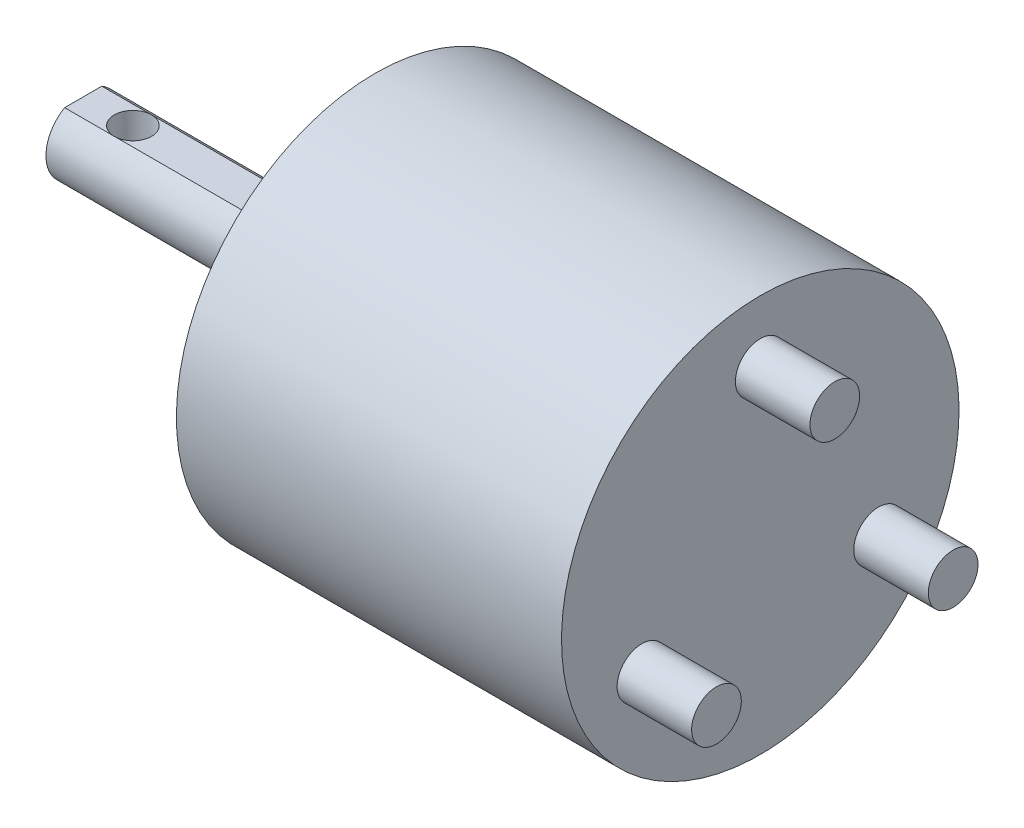
ISO-10303-21;
HEADER;
FILE_DESCRIPTION(('STEP AP214'),'2;1');
FILE_NAME('part.step','',(''),(''),'','','');
FILE_SCHEMA(('AUTOMOTIVE_DESIGN { 1 0 10303 214 1 1 1 1 }'));
ENDSEC;
DATA;
#1=APPLICATION_CONTEXT('core data for automotive mechanical design processes');
#2=APPLICATION_PROTOCOL_DEFINITION('international standard','automotive_design',2000,#1);
#3=PRODUCT_CONTEXT('',#1,'mechanical');
#4=PRODUCT('Part','Part','',(#3));
#5=PRODUCT_RELATED_PRODUCT_CATEGORY('part','',(#4));
#6=PRODUCT_DEFINITION_FORMATION('','',#4);
#7=PRODUCT_DEFINITION_CONTEXT('part definition',#1,'design');
#8=PRODUCT_DEFINITION('design','',#6,#7);
#9=PRODUCT_DEFINITION_SHAPE('','',#8);
#10=(LENGTH_UNIT() NAMED_UNIT(*) SI_UNIT(.MILLI.,.METRE.));
#11=(NAMED_UNIT(*) PLANE_ANGLE_UNIT() SI_UNIT($,.RADIAN.));
#12=(NAMED_UNIT(*) SI_UNIT($,.STERADIAN.) SOLID_ANGLE_UNIT());
#13=UNCERTAINTY_MEASURE_WITH_UNIT(LENGTH_MEASURE(1.E-05),#10,'distance_accuracy_value','');
#14=(GEOMETRIC_REPRESENTATION_CONTEXT(3) GLOBAL_UNCERTAINTY_ASSIGNED_CONTEXT((#13)) GLOBAL_UNIT_ASSIGNED_CONTEXT((#10,
#11,#12)) REPRESENTATION_CONTEXT('',''));
#15=CARTESIAN_POINT('',(0.,0.,0.));
#16=DIRECTION('',(0.,0.,1.));
#17=DIRECTION('',(1.,0.,0.));
#18=AXIS2_PLACEMENT_3D('',#15,#16,#17);
#19=CARTESIAN_POINT('',(-13.625,1.3,0.748331477));
#20=DIRECTION('',(0.,-1.,0.));
#21=DIRECTION('',(0.,0.,-1.));
#22=AXIS2_PLACEMENT_3D('',#19,#20,#21);
#23=PLANE('',#22);
#24=DIRECTION('',(1.,0.,0.));
#25=VECTOR('',#24,1.);
#26=CARTESIAN_POINT('',(-9.05,1.30000000000835,-0.748331477340291));
#27=LINE('',#26,#25);
#28=CARTESIAN_POINT('',(-5.8250000018,1.30000000000209,-0.748331477347535));
#29=VERTEX_POINT('',#28);
#30=CARTESIAN_POINT('',(-11.625,1.3,-0.748331477340291));
#31=VERTEX_POINT('',#30);
#32=EDGE_CURVE('E87',#29,#31,#27,.F.);
#33=ORIENTED_EDGE('',*,*,#32,.T.);
#34=CARTESIAN_POINT('',(-11.625,1.3,0.00166852265246463));
#35=DIRECTION('',(0.,-1.,0.));
#36=DIRECTION('',(0.,0.,-1.));
#37=AXIS2_PLACEMENT_3D('',#34,#35,#36);
#38=CIRCLE('',#37,0.75);
#39=CARTESIAN_POINT('',(-11.5543287095075,1.29999999970002,0.748331477876669));
#40=VERTEX_POINT('',#39);
#41=EDGE_CURVE('E74',#31,#40,#38,.T.);
#42=ORIENTED_EDGE('',*,*,#41,.T.);
#43=DIRECTION('',(-1.,0.,0.));
#44=VECTOR('',#43,1.);
#45=CARTESIAN_POINT('',(-9.05,1.29999999970137,0.74833147787356));
#46=LINE('',#45,#44);
#47=CARTESIAN_POINT('',(-5.8250000018,1.29999999992534,0.74833147761417));
#48=VERTEX_POINT('',#47);
#49=EDGE_CURVE('E84',#40,#48,#46,.F.);
#50=ORIENTED_EDGE('',*,*,#49,.T.);
#51=DIRECTION('',(0.,0.,1.));
#52=VECTOR('',#51,1.);
#53=CARTESIAN_POINT('',(-5.825,1.3,0.));
#54=LINE('',#53,#52);
#55=EDGE_CURVE('E88',#29,#48,#54,.T.);
#56=ORIENTED_EDGE('',*,*,#55,.F.);
#57=EDGE_LOOP('',(#33,#42,#50,#56));
#58=FACE_BOUND('',#57,.T.);
#59=ADVANCED_FACE('F34',(#58),#23,.F.);
#60=CARTESIAN_POINT('',(16.625,-3.762,-5.775139721));
#61=DIRECTION('',(1.,0.,0.));
#62=DIRECTION('',(0.,1.,0.));
#63=AXIS2_PLACEMENT_3D('',#60,#61,#62);
#64=PLANE('',#63);
#65=CARTESIAN_POINT('',(16.625,-2.75,-4.763139721));
#66=DIRECTION('',(1.,0.,0.));
#67=DIRECTION('',(0.,0.,-1.));
#68=AXIS2_PLACEMENT_3D('',#65,#66,#67);
#69=CIRCLE('',#68,1.);
#70=CARTESIAN_POINT('',(16.625,-2.75,-5.763139721));
#71=VERTEX_POINT('',#70);
#72=EDGE_CURVE('E111',#71,#71,#69,.T.);
#73=ORIENTED_EDGE('',*,*,#72,.T.);
#74=EDGE_LOOP('',(#73));
#75=FACE_BOUND('',#74,.T.);
#76=ADVANCED_FACE('F167',(#75),#64,.T.);
#77=CARTESIAN_POINT('',(16.625,-3.762,5.775139721));
#78=DIRECTION('',(1.,0.,0.));
#79=DIRECTION('',(0.,0.,-1.));
#80=AXIS2_PLACEMENT_3D('',#77,#78,#79);
#81=PLANE('',#80);
#82=CARTESIAN_POINT('',(16.625,-2.75,4.763139721));
#83=DIRECTION('',(1.,0.,0.));
#84=DIRECTION('',(0.,1.,0.));
#85=AXIS2_PLACEMENT_3D('',#82,#83,#84);
#86=CIRCLE('',#85,0.999999999999999);
#87=CARTESIAN_POINT('',(16.625,-1.75,4.763139721));
#88=VERTEX_POINT('',#87);
#89=EDGE_CURVE('E149',#88,#88,#86,.T.);
#90=ORIENTED_EDGE('',*,*,#89,.T.);
#91=EDGE_LOOP('',(#90));
#92=FACE_BOUND('',#91,.T.);
#93=ADVANCED_FACE('F207',(#92),#81,.T.);
#94=CARTESIAN_POINT('',(16.625,4.488,1.012));
#95=DIRECTION('',(1.,0.,0.));
#96=DIRECTION('',(0.,0.,-1.));
#97=AXIS2_PLACEMENT_3D('',#94,#95,#96);
#98=PLANE('',#97);
#99=CARTESIAN_POINT('',(16.625,5.5,0.));
#100=DIRECTION('',(1.,0.,0.));
#101=DIRECTION('',(0.,1.,0.));
#102=AXIS2_PLACEMENT_3D('',#99,#100,#101);
#103=CIRCLE('',#102,1.);
#104=CARTESIAN_POINT('',(16.625,6.5,0.));
#105=VERTEX_POINT('',#104);
#106=EDGE_CURVE('E95',#105,#105,#103,.T.);
#107=ORIENTED_EDGE('',*,*,#106,.T.);
#108=EDGE_LOOP('',(#107));
#109=FACE_BOUND('',#108,.T.);
#110=ADVANCED_FACE('F226',(#109),#98,.T.);
#111=CARTESIAN_POINT('',(-13.625,-1.5168,-1.518));
#112=DIRECTION('',(-1.,0.,0.));
#113=DIRECTION('',(0.,0.,1.));
#114=AXIS2_PLACEMENT_3D('',#111,#112,#113);
#115=PLANE('',#114);
#116=CARTESIAN_POINT('',(-13.625,0.,0.));
#117=DIRECTION('',(1.,0.,0.));
#118=DIRECTION('',(0.,1.,0.));
#119=AXIS2_PLACEMENT_3D('',#116,#117,#118);
#120=CIRCLE('',#119,1.5);
#121=CARTESIAN_POINT('',(-13.625,1.30000000000417,-0.748331477347539));
#122=VERTEX_POINT('',#121);
#123=CARTESIAN_POINT('',(-13.625,1.29999999985069,0.748331477614174));
#124=VERTEX_POINT('',#123);
#125=EDGE_CURVE('E94',#122,#124,#120,.F.);
#126=ORIENTED_EDGE('',*,*,#125,.T.);
#127=DIRECTION('',(0.,0.,-1.));
#128=VECTOR('',#127,1.);
#129=CARTESIAN_POINT('',(-13.625,1.3,0.));
#130=LINE('',#129,#128);
#131=EDGE_CURVE('E108',#124,#122,#130,.T.);
#132=ORIENTED_EDGE('',*,*,#131,.T.);
#133=EDGE_LOOP('',(#126,#132));
#134=FACE_BOUND('',#133,.T.);
#135=ADVANCED_FACE('F222',(#134),#115,.T.);
#136=CARTESIAN_POINT('',(-5.825,1.3,-0.757311455));
#137=DIRECTION('',(-1.,0.,0.));
#138=DIRECTION('',(0.,0.,1.));
#139=AXIS2_PLACEMENT_3D('',#136,#137,#138);
#140=PLANE('',#139);
#141=CARTESIAN_POINT('',(-5.8250000036,0.,0.));
#142=DIRECTION('',(1.,0.,0.));
#143=DIRECTION('',(0.,1.,0.));
#144=AXIS2_PLACEMENT_3D('',#141,#142,#143);
#145=CIRCLE('',#144,1.5);
#146=EDGE_CURVE('E93',#48,#29,#145,.F.);
#147=ORIENTED_EDGE('',*,*,#146,.T.);
#148=ORIENTED_EDGE('',*,*,#55,.T.);
#149=EDGE_LOOP('',(#147,#148));
#150=FACE_BOUND('',#149,.T.);
#151=ADVANCED_FACE('F214',(#150),#140,.T.);
#152=CARTESIAN_POINT('',(-11.6956712904969,1.29999999970137,0.74833147787356));
#153=VERTEX_POINT('',#152);
#154=EDGE_CURVE('E38',#124,#153,#46,.F.);
#155=ORIENTED_EDGE('',*,*,#154,.T.);
#156=EDGE_CURVE('E50',#153,#31,#38,.T.);
#157=ORIENTED_EDGE('',*,*,#156,.T.);
#158=EDGE_CURVE('E57',#31,#122,#27,.F.);
#159=ORIENTED_EDGE('',*,*,#158,.T.);
#160=ORIENTED_EDGE('',*,*,#131,.F.);
#161=EDGE_LOOP('',(#155,#157,#159,#160));
#162=FACE_BOUND('',#161,.T.);
#163=ADVANCED_FACE('F203',(#162),#23,.F.);
#164=CARTESIAN_POINT('',(13.625,-2.75,-4.763139721));
#165=DIRECTION('',(1.,0.,0.));
#166=DIRECTION('',(0.,0.,-1.));
#167=AXIS2_PLACEMENT_3D('',#164,#165,#166);
#168=CYLINDRICAL_SURFACE('',#167,1.);
#169=CARTESIAN_POINT('',(13.625,-2.75,-4.763139721));
#170=DIRECTION('',(1.,0.,0.));
#171=DIRECTION('',(0.,0.,-1.));
#172=AXIS2_PLACEMENT_3D('',#169,#170,#171);
#173=CIRCLE('',#172,1.);
#174=CARTESIAN_POINT('',(13.625,-2.75,-5.763139721));
#175=VERTEX_POINT('',#174);
#176=EDGE_CURVE('E106',#175,#175,#173,.F.);
#177=ORIENTED_EDGE('',*,*,#176,.F.);
#178=EDGE_LOOP('',(#177));
#179=FACE_BOUND('',#178,.T.);
#180=ORIENTED_EDGE('',*,*,#72,.F.);
#181=EDGE_LOOP('',(#180));
#182=FACE_BOUND('',#181,.T.);
#183=ADVANCED_FACE('F213',(#179,#182),#168,.T.);
#184=CARTESIAN_POINT('',(13.625,-2.75,4.763139721));
#185=DIRECTION('',(1.,0.,0.));
#186=DIRECTION('',(0.,1.,0.));
#187=AXIS2_PLACEMENT_3D('',#184,#185,#186);
#188=CYLINDRICAL_SURFACE('',#187,0.999999999999999);
#189=CARTESIAN_POINT('',(13.625,-2.75,4.763139721));
#190=DIRECTION('',(1.,0.,0.));
#191=DIRECTION('',(0.,1.,0.));
#192=AXIS2_PLACEMENT_3D('',#189,#190,#191);
#193=CIRCLE('',#192,0.999999999999999);
#194=CARTESIAN_POINT('',(13.625,-1.75,4.763139721));
#195=VERTEX_POINT('',#194);
#196=EDGE_CURVE('E141',#195,#195,#193,.F.);
#197=ORIENTED_EDGE('',*,*,#196,.F.);
#198=EDGE_LOOP('',(#197));
#199=FACE_BOUND('',#198,.T.);
#200=ORIENTED_EDGE('',*,*,#89,.F.);
#201=EDGE_LOOP('',(#200));
#202=FACE_BOUND('',#201,.T.);
#203=ADVANCED_FACE('F219',(#199,#202),#188,.T.);
#204=CARTESIAN_POINT('',(13.625,5.5,0.));
#205=DIRECTION('',(1.,0.,0.));
#206=DIRECTION('',(0.,1.,0.));
#207=AXIS2_PLACEMENT_3D('',#204,#205,#206);
#208=CYLINDRICAL_SURFACE('',#207,1.);
#209=CARTESIAN_POINT('',(13.625,5.5,0.));
#210=DIRECTION('',(1.,0.,0.));
#211=DIRECTION('',(0.,1.,0.));
#212=AXIS2_PLACEMENT_3D('',#209,#210,#211);
#213=CIRCLE('',#212,1.);
#214=CARTESIAN_POINT('',(13.625,6.5,0.));
#215=VERTEX_POINT('',#214);
#216=EDGE_CURVE('E138',#215,#215,#213,.F.);
#217=ORIENTED_EDGE('',*,*,#216,.F.);
#218=EDGE_LOOP('',(#217));
#219=FACE_BOUND('',#218,.T.);
#220=ORIENTED_EDGE('',*,*,#106,.F.);
#221=EDGE_LOOP('',(#220));
#222=FACE_BOUND('',#221,.T.);
#223=ADVANCED_FACE('F238',(#219,#222),#208,.T.);
#224=CARTESIAN_POINT('',(-13.625,0.,0.));
#225=DIRECTION('',(1.,0.,0.));
#226=DIRECTION('',(0.,1.,0.));
#227=AXIS2_PLACEMENT_3D('',#224,#225,#226);
#228=CYLINDRICAL_SURFACE('',#227,1.5);
#229=CARTESIAN_POINT('',(-11.625,-1.29807335388007,0.751668522652465));
#230=CARTESIAN_POINT('',(-11.5859352661064,-1.29807676515365,0.751665792727671));
#231=CARTESIAN_POINT('',(-11.5468211622539,-1.29986759555065,0.748595991822602));
#232=CARTESIAN_POINT('',(-11.4697941737744,-1.30677162186917,0.736473695787898));
#233=CARTESIAN_POINT('',(-11.4318839921228,-1.31189180608822,0.727408615910873));
#234=CARTESIAN_POINT('',(-11.3585250421083,-1.32471264995779,0.70378562908831));
#235=CARTESIAN_POINT('',(-11.3230643145116,-1.33239951658162,0.689257030814035));
#236=CARTESIAN_POINT('',(-11.2550931744502,-1.34946744694339,0.655209255349746));
#237=CARTESIAN_POINT('',(-11.222582922653,-1.35884860286041,0.635689806604712));
#238=CARTESIAN_POINT('',(-11.1584619727746,-1.37919917378084,0.590319207880055));
#239=CARTESIAN_POINT('',(-11.1271487978712,-1.39023578178402,0.564077538799501));
#240=CARTESIAN_POINT('',(-11.0691365438864,-1.41211652462639,0.50682000588291));
#241=CARTESIAN_POINT('',(-11.0424397810618,-1.42296056040937,0.47580176009873));
#242=CARTESIAN_POINT('',(-10.9926396304566,-1.4441193193106,0.4072940759992));
#243=CARTESIAN_POINT('',(-10.9699043073248,-1.45434783162889,0.369507941034256));
#244=CARTESIAN_POINT('',(-10.9312491040222,-1.47225367413343,0.290040110389629));
#245=CARTESIAN_POINT('',(-10.9153249352702,-1.47993260895433,0.248360886162446));
#246=CARTESIAN_POINT('',(-10.8919203611998,-1.49139538011761,0.165425846633867));
#247=CARTESIAN_POINT('',(-10.8839205182661,-1.49541715155148,0.124350255774413));
#248=CARTESIAN_POINT('',(-10.8748826839755,-1.50000831722362,0.0412585171227328));
#249=CARTESIAN_POINT('',(-10.8738404512806,-1.50057981471815,-0.000757041989597624));
#250=CARTESIAN_POINT('',(-10.8785484712954,-1.49831878162007,-0.0806053392998059));
#251=CARTESIAN_POINT('',(-10.8837133921808,-1.49577921258974,-0.118482886115949));
#252=CARTESIAN_POINT('',(-10.8996426418441,-1.48803258919824,-0.1927519635836));
#253=CARTESIAN_POINT('',(-10.9104073806599,-1.48282533950068,-0.229143385205401));
#254=CARTESIAN_POINT('',(-10.9372946208068,-1.47013631088269,-0.300023656422881));
#255=CARTESIAN_POINT('',(-10.9534868146943,-1.46262505926959,-0.334480572746974));
#256=CARTESIAN_POINT('',(-10.9906713208299,-1.44600656397691,-0.400272502458913));
#257=CARTESIAN_POINT('',(-11.0116653458743,-1.43689875108098,-0.431606396135818));
#258=CARTESIAN_POINT('',(-11.0601305365355,-1.41693126516614,-0.493414008734218));
#259=CARTESIAN_POINT('',(-11.088025673368,-1.4059873847138,-0.523528336857089));
#260=CARTESIAN_POINT('',(-11.1483663088471,-1.3841326308634,-0.578846510062908));
#261=CARTESIAN_POINT('',(-11.180815260979,-1.37322178899663,-0.60404659333582));
#262=CARTESIAN_POINT('',(-11.2518662123329,-1.35191835101475,-0.650391033984594));
#263=CARTESIAN_POINT('',(-11.290728239641,-1.34160280128608,-0.67117569658398));
#264=CARTESIAN_POINT('',(-11.3720300134045,-1.32374028501834,-0.705757934426472));
#265=CARTESIAN_POINT('',(-11.4144660087038,-1.3161904590994,-0.719562731543159));
#266=CARTESIAN_POINT('',(-11.4982019982089,-1.30555028065809,-0.738681420589275));
#267=CARTESIAN_POINT('',(-11.5393289231482,-1.30215594311373,-0.7445776303071));
#268=CARTESIAN_POINT('',(-11.6221148247752,-1.29934837961226,-0.749468974055903));
#269=CARTESIAN_POINT('',(-11.663773405994,-1.29993234912065,-0.748468969613665));
#270=CARTESIAN_POINT('',(-11.7416013823901,-1.30469222564072,-0.740131726330189));
#271=CARTESIAN_POINT('',(-11.7778743900066,-1.30846991863295,-0.733496694727375));
#272=CARTESIAN_POINT('',(-11.8487234108368,-1.3186016922741,-0.715121526777864));
#273=CARTESIAN_POINT('',(-11.8832988722185,-1.32495660458019,-0.703379742416186));
#274=CARTESIAN_POINT('',(-11.9515819927255,-1.33986811211099,-0.674556984738675));
#275=CARTESIAN_POINT('',(-11.9851765357564,-1.34851255193803,-0.657255216992295));
#276=CARTESIAN_POINT('',(-12.0491793453798,-1.36694991680797,-0.617995182191977));
#277=CARTESIAN_POINT('',(-12.0795859655433,-1.37674342982026,-0.596034526546049));
#278=CARTESIAN_POINT('',(-12.1403399955023,-1.39785031505607,-0.544859815090664));
#279=CARTESIAN_POINT('',(-12.170201581797,-1.40920024265393,-0.515081461069565));
#280=CARTESIAN_POINT('',(-12.2246562868979,-1.43107382280767,-0.450756638062975));
#281=CARTESIAN_POINT('',(-12.2492476480664,-1.44159719896695,-0.416208584663107));
#282=CARTESIAN_POINT('',(-12.2930015992195,-1.46098440121483,-0.342092743958092));
#283=CARTESIAN_POINT('',(-12.3120067226987,-1.46979806563935,-0.302417944863184));
#284=CARTESIAN_POINT('',(-12.3428850436092,-1.48438842059188,-0.219867623676152));
#285=CARTESIAN_POINT('',(-12.3547644952764,-1.4901677737918,-0.176994945654077));
#286=CARTESIAN_POINT('',(-12.3700328183079,-1.49761452367608,-0.0935097815924676));
#287=CARTESIAN_POINT('',(-12.3741002667951,-1.49961033269471,-0.0530504445555278));
#288=CARTESIAN_POINT('',(-12.3756313746518,-1.50028520252763,0.0280148840724635));
#289=CARTESIAN_POINT('',(-12.3730973251445,-1.49896541406257,0.0686208199001151));
#290=CARTESIAN_POINT('',(-12.3619462692761,-1.49334686204106,0.146027039206788));
#291=CARTESIAN_POINT('',(-12.3537385193265,-1.48924885951574,0.182902394851165));
#292=CARTESIAN_POINT('',(-12.3320266715415,-1.47866493359104,0.254690700387663));
#293=CARTESIAN_POINT('',(-12.318521808464,-1.47217866518155,0.289603365908199));
#294=CARTESIAN_POINT('',(-12.2859922508111,-1.45705260577491,0.358166986428776));
#295=CARTESIAN_POINT('',(-12.2667545294801,-1.44833197048854,0.391698502743213));
#296=CARTESIAN_POINT('',(-12.2235728691616,-1.42964838845444,0.455195265957163));
#297=CARTESIAN_POINT('',(-12.1996267610378,-1.41968486989132,0.4851588588734));
#298=CARTESIAN_POINT('',(-12.1449393174475,-1.3983308781463,0.543819259236857));
#299=CARTESIAN_POINT('',(-12.1137584660953,-1.38689719199609,0.572091718700382));
#300=CARTESIAN_POINT('',(-12.046924271934,-1.36471633095126,0.623158474190228));
#301=CARTESIAN_POINT('',(-12.0112670059106,-1.35396977089133,0.645947913062389));
#302=CARTESIAN_POINT('',(-11.9350009838461,-1.33413541067135,0.686002194873948));
#303=CARTESIAN_POINT('',(-11.8942717570388,-1.3251104209729,0.703070709397562));
#304=CARTESIAN_POINT('',(-11.809941542259,-1.31055976605406,0.729843322032333));
#305=CARTESIAN_POINT('',(-11.7663507344148,-1.30502236718855,0.739572135918786));
#306=CARTESIAN_POINT('',(-11.7060702271124,-1.30050746600672,0.747451686631165));
#307=CARTESIAN_POINT('',(-11.6899134074318,-1.29959788969452,0.749030543012315));
#308=CARTESIAN_POINT('',(-11.6575072463194,-1.29838010345837,0.751139564532125));
#309=CARTESIAN_POINT('',(-11.6412578987084,-1.29807193418168,0.751669658788216));
#310=CARTESIAN_POINT('',(-11.625,-1.29807335388007,0.751668522652465));
#311=B_SPLINE_CURVE_WITH_KNOTS('',3,(#229,#230,#231,#232,#233,#234,#235,#236,#237,#238,#239,
#240,#241,#242,#243,#244,#245,#246,#247,#248,#249,#250,#251,#252,#253,#254,#255,#256,#257,#258,
#259,#260,#261,#262,#263,#264,#265,#266,#267,#268,#269,#270,#271,#272,#273,#274,#275,#276,#277,
#278,#279,#280,#281,#282,#283,#284,#285,#286,#287,#288,#289,#290,#291,#292,#293,#294,#295,#296,
#297,#298,#299,#300,#301,#302,#303,#304,#305,#306,#307,#308,#309,#310),.UNSPECIFIED.,.T.,.F.,(4,
2,2,2,2,2,2,2,2,2,2,2,2,2,2,2,2,2,2,2,2,2,2,2,2,2,2,2,2,2,2,2,2,2,2,2,2,2,2,2,4),(0.,
0.117125747681228,0.234498138812895,0.351249673301424,0.468007561659839,0.594435883923829,
0.720927457925936,0.856025173892625,0.991037701144751,1.11645988048859,1.24180559586302,
1.35620311231394,1.47060900652598,1.58654413618016,1.70252068415557,1.82942765142178,
1.9564313867371,2.09150936343191,2.22644729120323,2.3507744409087,2.47501395442175,
2.58571955551345,2.6964609092702,2.81229733661382,2.92819329694905,3.05862637359937,
3.1891028826563,3.32296584107448,3.45671113476438,3.57819444478352,3.69963559828558,
3.8131232832583,3.92662736915635,4.04502892267139,4.16348515169197,4.29375487961528,
4.42413958603593,4.55862561819752,4.69265673423356,4.74139864708057,4.7901438541293),.UNSPECIFIED.);
#312=CARTESIAN_POINT('',(-11.625,-1.29807335388007,0.751668522652465));
#313=VERTEX_POINT('',#312);
#314=EDGE_CURVE('E154',#313,#313,#311,.T.);
#315=ORIENTED_EDGE('',*,*,#314,.T.);
#316=EDGE_LOOP('',(#315));
#317=FACE_BOUND('',#316,.T.);
#318=CARTESIAN_POINT('',(-4.475,0.,0.));
#319=DIRECTION('',(1.,0.,0.));
#320=DIRECTION('',(0.,1.,0.));
#321=AXIS2_PLACEMENT_3D('',#318,#319,#320);
#322=CIRCLE('',#321,1.5);
#323=CARTESIAN_POINT('',(-4.475,1.49999999999999,0.));
#324=VERTEX_POINT('',#323);
#325=EDGE_CURVE('E135',#324,#324,#322,.T.);
#326=ORIENTED_EDGE('',*,*,#325,.F.);
#327=EDGE_LOOP('',(#326));
#328=FACE_BOUND('',#327,.T.);
#329=ORIENTED_EDGE('',*,*,#49,.F.);
#330=CARTESIAN_POINT('',(-11.625,1.29999999970136,0.00166852265246463));
#331=DIRECTION('',(0.,1.,0.));
#332=DIRECTION('',(-0.0942283873289392,0.,0.995550606961488));
#333=AXIS2_PLACEMENT_3D('',#330,#331,#332);
#334=CIRCLE('',#333,0.75);
#335=EDGE_CURVE('E11',#153,#40,#334,.T.);
#336=ORIENTED_EDGE('',*,*,#335,.F.);
#337=ORIENTED_EDGE('',*,*,#154,.F.);
#338=ORIENTED_EDGE('',*,*,#125,.F.);
#339=ORIENTED_EDGE('',*,*,#158,.F.);
#340=ORIENTED_EDGE('',*,*,#32,.F.);
#341=ORIENTED_EDGE('',*,*,#146,.F.);
#342=EDGE_LOOP('',(#329,#336,#337,#338,#339,#340,#341));
#343=FACE_BOUND('',#342,.T.);
#344=ADVANCED_FACE('F91',(#317,#328,#343),#228,.T.);
#345=CARTESIAN_POINT('',(13.625,-8.096,8.096));
#346=DIRECTION('',(1.,0.,0.));
#347=DIRECTION('',(0.,0.,-1.));
#348=AXIS2_PLACEMENT_3D('',#345,#346,#347);
#349=PLANE('',#348);
#350=ORIENTED_EDGE('',*,*,#216,.T.);
#351=EDGE_LOOP('',(#350));
#352=FACE_BOUND('',#351,.T.);
#353=ORIENTED_EDGE('',*,*,#196,.T.);
#354=EDGE_LOOP('',(#353));
#355=FACE_BOUND('',#354,.T.);
#356=ORIENTED_EDGE('',*,*,#176,.T.);
#357=EDGE_LOOP('',(#356));
#358=FACE_BOUND('',#357,.T.);
#359=CARTESIAN_POINT('',(13.625,0.,0.));
#360=DIRECTION('',(1.,0.,0.));
#361=DIRECTION('',(0.,1.,0.));
#362=AXIS2_PLACEMENT_3D('',#359,#360,#361);
#363=CIRCLE('',#362,8.);
#364=CARTESIAN_POINT('',(13.625,8.,0.));
#365=VERTEX_POINT('',#364);
#366=EDGE_CURVE('E132',#365,#365,#363,.T.);
#367=ORIENTED_EDGE('',*,*,#366,.T.);
#368=EDGE_LOOP('',(#367));
#369=FACE_BOUND('',#368,.T.);
#370=ADVANCED_FACE('F245',(#352,#355,#358,#369),#349,.T.);
#371=CARTESIAN_POINT('',(1.125,4.207098,0.792902));
#372=DIRECTION('',(1.,0.,0.));
#373=DIRECTION('',(0.,0.,-1.));
#374=AXIS2_PLACEMENT_3D('',#371,#372,#373);
#375=PLANE('',#374);
#376=CARTESIAN_POINT('',(1.125,5.,0.));
#377=DIRECTION('',(-1.,0.,0.));
#378=DIRECTION('',(0.,0.,1.));
#379=AXIS2_PLACEMENT_3D('',#376,#377,#378);
#380=CIRCLE('',#379,0.7835);
#381=CARTESIAN_POINT('',(1.125,5.,0.7835));
#382=VERTEX_POINT('',#381);
#383=EDGE_CURVE('E129',#382,#382,#380,.F.);
#384=ORIENTED_EDGE('',*,*,#383,.F.);
#385=EDGE_LOOP('',(#384));
#386=FACE_BOUND('',#385,.T.);
#387=ADVANCED_FACE('F196',(#386),#375,.F.);
#388=CARTESIAN_POINT('',(-4.475,-3.036,-3.036));
#389=DIRECTION('',(-1.,0.,0.));
#390=DIRECTION('',(0.,0.,1.));
#391=AXIS2_PLACEMENT_3D('',#388,#389,#390);
#392=PLANE('',#391);
#393=ORIENTED_EDGE('',*,*,#325,.T.);
#394=EDGE_LOOP('',(#393));
#395=FACE_BOUND('',#394,.T.);
#396=CARTESIAN_POINT('',(-4.475,0.,0.));
#397=DIRECTION('',(1.,0.,0.));
#398=DIRECTION('',(0.,1.,0.));
#399=AXIS2_PLACEMENT_3D('',#396,#397,#398);
#400=CIRCLE('',#399,3.);
#401=CARTESIAN_POINT('',(-4.475,3.,0.));
#402=VERTEX_POINT('',#401);
#403=EDGE_CURVE('E126',#402,#402,#400,.F.);
#404=ORIENTED_EDGE('',*,*,#403,.T.);
#405=EDGE_LOOP('',(#404));
#406=FACE_BOUND('',#405,.T.);
#407=ADVANCED_FACE('F191',(#395,#406),#392,.T.);
#408=CARTESIAN_POINT('',(-1.875,0.,0.));
#409=DIRECTION('',(1.,0.,0.));
#410=DIRECTION('',(0.,1.,0.));
#411=AXIS2_PLACEMENT_3D('',#408,#409,#410);
#412=CYLINDRICAL_SURFACE('',#411,8.);
#413=CARTESIAN_POINT('',(-1.875,0.,0.));
#414=DIRECTION('',(1.,0.,0.));
#415=DIRECTION('',(0.,1.,0.));
#416=AXIS2_PLACEMENT_3D('',#413,#414,#415);
#417=CIRCLE('',#416,8.);
#418=CARTESIAN_POINT('',(-1.875,8.,0.));
#419=VERTEX_POINT('',#418);
#420=EDGE_CURVE('E123',#419,#419,#417,.F.);
#421=ORIENTED_EDGE('',*,*,#420,.F.);
#422=EDGE_LOOP('',(#421));
#423=FACE_BOUND('',#422,.T.);
#424=ORIENTED_EDGE('',*,*,#366,.F.);
#425=EDGE_LOOP('',(#424));
#426=FACE_BOUND('',#425,.T.);
#427=ADVANCED_FACE('F188',(#423,#426),#412,.T.);
#428=CARTESIAN_POINT('',(1.125,5.,0.));
#429=DIRECTION('',(-1.,0.,0.));
#430=DIRECTION('',(0.,0.,1.));
#431=AXIS2_PLACEMENT_3D('',#428,#429,#430);
#432=CYLINDRICAL_SURFACE('',#431,0.7835);
#433=CARTESIAN_POINT('',(-1.875,5.,0.));
#434=DIRECTION('',(-1.,0.,0.));
#435=DIRECTION('',(0.,0.,1.));
#436=AXIS2_PLACEMENT_3D('',#433,#434,#435);
#437=CIRCLE('',#436,0.7835);
#438=CARTESIAN_POINT('',(-1.875,5.,0.7835));
#439=VERTEX_POINT('',#438);
#440=EDGE_CURVE('E120',#439,#439,#437,.F.);
#441=ORIENTED_EDGE('',*,*,#440,.F.);
#442=EDGE_LOOP('',(#441));
#443=FACE_BOUND('',#442,.T.);
#444=ORIENTED_EDGE('',*,*,#383,.T.);
#445=EDGE_LOOP('',(#444));
#446=FACE_BOUND('',#445,.T.);
#447=ADVANCED_FACE('F185',(#443,#446),#432,.F.);
#448=CARTESIAN_POINT('',(-4.475,0.,0.));
#449=DIRECTION('',(1.,0.,0.));
#450=DIRECTION('',(0.,1.,0.));
#451=AXIS2_PLACEMENT_3D('',#448,#449,#450);
#452=CYLINDRICAL_SURFACE('',#451,3.);
#453=CARTESIAN_POINT('',(-1.875,0.,0.));
#454=DIRECTION('',(1.,0.,0.));
#455=DIRECTION('',(0.,1.,0.));
#456=AXIS2_PLACEMENT_3D('',#453,#454,#455);
#457=CIRCLE('',#456,3.);
#458=CARTESIAN_POINT('',(-1.875,3.,0.));
#459=VERTEX_POINT('',#458);
#460=EDGE_CURVE('E117',#459,#459,#457,.T.);
#461=ORIENTED_EDGE('',*,*,#460,.F.);
#462=EDGE_LOOP('',(#461));
#463=FACE_BOUND('',#462,.T.);
#464=ORIENTED_EDGE('',*,*,#403,.F.);
#465=EDGE_LOOP('',(#464));
#466=FACE_BOUND('',#465,.T.);
#467=ADVANCED_FACE('F181',(#463,#466),#452,.T.);
#468=CARTESIAN_POINT('',(1.125,-5.792902,0.792902));
#469=DIRECTION('',(1.,0.,0.));
#470=DIRECTION('',(0.,0.,-1.));
#471=AXIS2_PLACEMENT_3D('',#468,#469,#470);
#472=PLANE('',#471);
#473=CARTESIAN_POINT('',(1.125,-5.,0.));
#474=DIRECTION('',(-1.,0.,0.));
#475=DIRECTION('',(0.,0.,1.));
#476=AXIS2_PLACEMENT_3D('',#473,#474,#475);
#477=CIRCLE('',#476,0.7835);
#478=CARTESIAN_POINT('',(1.125,-5.,0.7835));
#479=VERTEX_POINT('',#478);
#480=EDGE_CURVE('E114',#479,#479,#477,.F.);
#481=ORIENTED_EDGE('',*,*,#480,.F.);
#482=EDGE_LOOP('',(#481));
#483=FACE_BOUND('',#482,.T.);
#484=ADVANCED_FACE('F184',(#483),#472,.F.);
#485=CARTESIAN_POINT('',(-1.875,-8.096,-8.096));
#486=DIRECTION('',(-1.,0.,0.));
#487=DIRECTION('',(0.,0.,1.));
#488=AXIS2_PLACEMENT_3D('',#485,#486,#487);
#489=PLANE('',#488);
#490=ORIENTED_EDGE('',*,*,#460,.T.);
#491=EDGE_LOOP('',(#490));
#492=FACE_BOUND('',#491,.T.);
#493=ORIENTED_EDGE('',*,*,#440,.T.);
#494=EDGE_LOOP('',(#493));
#495=FACE_BOUND('',#494,.T.);
#496=CARTESIAN_POINT('',(-1.875,-5.,0.));
#497=DIRECTION('',(-1.,0.,0.));
#498=DIRECTION('',(0.,0.,1.));
#499=AXIS2_PLACEMENT_3D('',#496,#497,#498);
#500=CIRCLE('',#499,0.7835);
#501=CARTESIAN_POINT('',(-1.875,-5.,0.7835));
#502=VERTEX_POINT('',#501);
#503=EDGE_CURVE('E44',#502,#502,#500,.T.);
#504=ORIENTED_EDGE('',*,*,#503,.F.);
#505=EDGE_LOOP('',(#504));
#506=FACE_BOUND('',#505,.T.);
#507=ORIENTED_EDGE('',*,*,#420,.T.);
#508=EDGE_LOOP('',(#507));
#509=FACE_BOUND('',#508,.T.);
#510=ADVANCED_FACE('F36',(#492,#495,#506,#509),#489,.T.);
#511=CARTESIAN_POINT('',(1.125,-5.,0.));
#512=DIRECTION('',(-1.,0.,0.));
#513=DIRECTION('',(0.,0.,1.));
#514=AXIS2_PLACEMENT_3D('',#511,#512,#513);
#515=CYLINDRICAL_SURFACE('',#514,0.7835);
#516=ORIENTED_EDGE('',*,*,#503,.T.);
#517=EDGE_LOOP('',(#516));
#518=FACE_BOUND('',#517,.T.);
#519=ORIENTED_EDGE('',*,*,#480,.T.);
#520=EDGE_LOOP('',(#519));
#521=FACE_BOUND('',#520,.T.);
#522=ADVANCED_FACE('F165',(#518,#521),#515,.F.);
#523=CARTESIAN_POINT('',(-11.625,-8.,0.00166852265246463));
#524=DIRECTION('',(0.,1.,0.));
#525=DIRECTION('',(0.,0.,1.));
#526=AXIS2_PLACEMENT_3D('',#523,#524,#525);
#527=CYLINDRICAL_SURFACE('',#526,0.75);
#528=ORIENTED_EDGE('',*,*,#314,.F.);
#529=EDGE_LOOP('',(#528));
#530=FACE_BOUND('',#529,.T.);
#531=ORIENTED_EDGE('',*,*,#156,.F.);
#532=ORIENTED_EDGE('',*,*,#335,.T.);
#533=ORIENTED_EDGE('',*,*,#41,.F.);
#534=EDGE_LOOP('',(#531,#532,#533));
#535=FACE_BOUND('',#534,.T.);
#536=ADVANCED_FACE('F73',(#530,#535),#527,.F.);
#537=CLOSED_SHELL('',(#59,#76,#93,#110,#135,#151,#163,#183,#203,#223,#344,#370,#387,#407,#427,
#447,#467,#484,#510,#522,#536));
#538=MANIFOLD_SOLID_BREP('B2',#537);
#539=ADVANCED_BREP_SHAPE_REPRESENTATION('',(#18,#538),#14);
#540=SHAPE_DEFINITION_REPRESENTATION(#9,#539);
ENDSEC;
END-ISO-10303-21;
